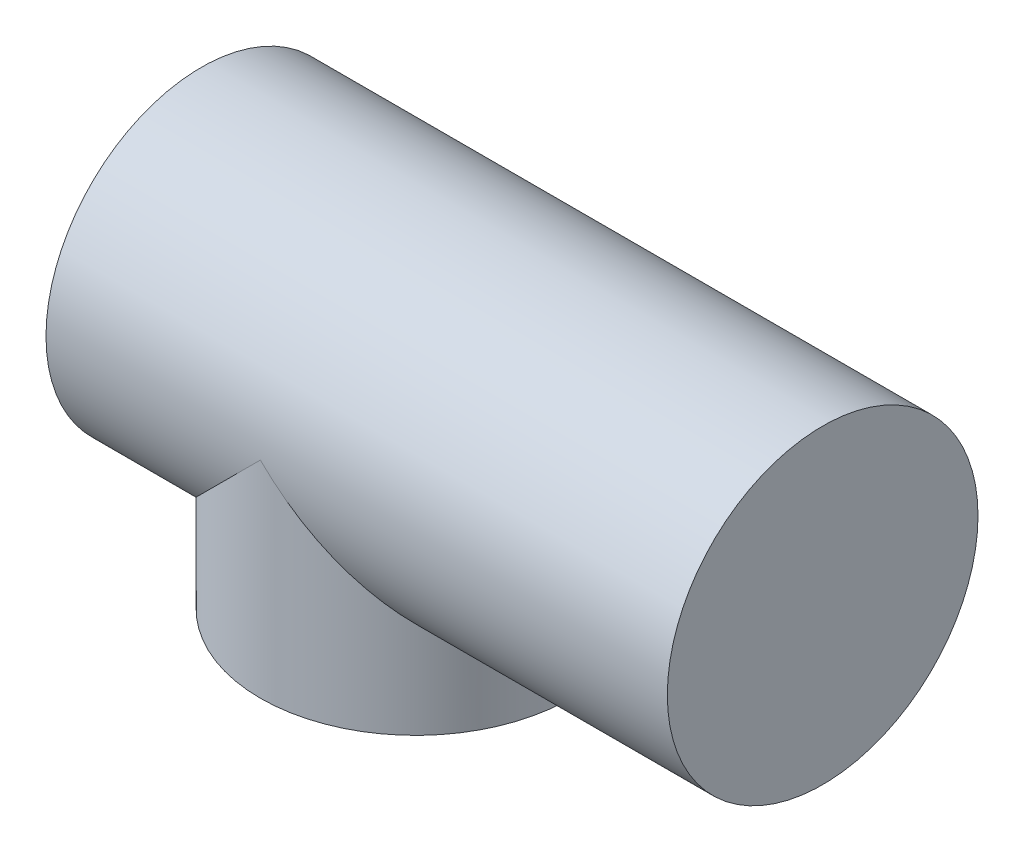
ISO-10303-21;
HEADER;
FILE_DESCRIPTION(('STEP AP214'),'2;1');
FILE_NAME('part.step','',(''),(''),'','','');
FILE_SCHEMA(('AUTOMOTIVE_DESIGN { 1 0 10303 214 1 1 1 1 }'));
ENDSEC;
DATA;
#1=APPLICATION_CONTEXT('core data for automotive mechanical design processes');
#2=APPLICATION_PROTOCOL_DEFINITION('international standard','automotive_design',2000,#1);
#3=PRODUCT_CONTEXT('',#1,'mechanical');
#4=PRODUCT('Part','Part','',(#3));
#5=PRODUCT_RELATED_PRODUCT_CATEGORY('part','',(#4));
#6=PRODUCT_DEFINITION_FORMATION('','',#4);
#7=PRODUCT_DEFINITION_CONTEXT('part definition',#1,'design');
#8=PRODUCT_DEFINITION('design','',#6,#7);
#9=PRODUCT_DEFINITION_SHAPE('','',#8);
#10=(LENGTH_UNIT() NAMED_UNIT(*) SI_UNIT(.MILLI.,.METRE.));
#11=(NAMED_UNIT(*) PLANE_ANGLE_UNIT() SI_UNIT($,.RADIAN.));
#12=(NAMED_UNIT(*) SI_UNIT($,.STERADIAN.) SOLID_ANGLE_UNIT());
#13=UNCERTAINTY_MEASURE_WITH_UNIT(LENGTH_MEASURE(1.E-05),#10,'distance_accuracy_value','');
#14=(GEOMETRIC_REPRESENTATION_CONTEXT(3) GLOBAL_UNCERTAINTY_ASSIGNED_CONTEXT((#13)) GLOBAL_UNIT_ASSIGNED_CONTEXT((#10,
#11,#12)) REPRESENTATION_CONTEXT('',''));
#15=CARTESIAN_POINT('',(0.,0.,0.));
#16=DIRECTION('',(0.,0.,1.));
#17=DIRECTION('',(1.,0.,0.));
#18=AXIS2_PLACEMENT_3D('',#15,#16,#17);
#19=CARTESIAN_POINT('',(0.,0.,0.));
#20=DIRECTION('',(1.,0.,0.));
#21=DIRECTION('',(0.,0.,-1.));
#22=AXIS2_PLACEMENT_3D('',#19,#20,#21);
#23=PLANE('',#22);
#24=CARTESIAN_POINT('',(0.,0.,0.));
#25=DIRECTION('',(1.,0.,0.));
#26=DIRECTION('',(0.,0.,-1.));
#27=AXIS2_PLACEMENT_3D('',#24,#25,#26);
#28=CIRCLE('',#27,25.);
#29=CARTESIAN_POINT('',(0.,0.,-25.));
#30=VERTEX_POINT('',#29);
#31=EDGE_CURVE('E64',#30,#30,#28,.T.);
#32=ORIENTED_EDGE('',*,*,#31,.F.);
#33=EDGE_LOOP('',(#32));
#34=FACE_BOUND('',#33,.T.);
#35=ADVANCED_FACE('F45',(#34),#23,.F.);
#36=CARTESIAN_POINT('',(100.,0.,0.));
#37=DIRECTION('',(1.,0.,0.));
#38=DIRECTION('',(0.,0.,-1.));
#39=AXIS2_PLACEMENT_3D('',#36,#37,#38);
#40=PLANE('',#39);
#41=CARTESIAN_POINT('',(100.,0.,0.));
#42=DIRECTION('',(1.,0.,0.));
#43=DIRECTION('',(0.,0.,-1.));
#44=AXIS2_PLACEMENT_3D('',#41,#42,#43);
#45=CIRCLE('',#44,25.);
#46=CARTESIAN_POINT('',(100.,0.,-25.));
#47=VERTEX_POINT('',#46);
#48=EDGE_CURVE('E62',#47,#47,#45,.T.);
#49=ORIENTED_EDGE('',*,*,#48,.T.);
#50=EDGE_LOOP('',(#49));
#51=FACE_BOUND('',#50,.T.);
#52=ADVANCED_FACE('F82',(#51),#40,.T.);
#53=CARTESIAN_POINT('',(0.,0.,0.));
#54=DIRECTION('',(1.,0.,0.));
#55=DIRECTION('',(0.,0.,-1.));
#56=AXIS2_PLACEMENT_3D('',#53,#54,#55);
#57=CYLINDRICAL_SURFACE('',#56,25.);
#58=CARTESIAN_POINT('',(34.5,0.,0.));
#59=DIRECTION('',(0.707106781186548,0.707106781186547,0.));
#60=DIRECTION('',(0.707106781186548,-0.707106781186547,0.));
#61=AXIS2_PLACEMENT_3D('',#58,#59,#60);
#62=ELLIPSE('',#61,35.3553390593274,25.);
#63=CARTESIAN_POINT('',(34.5,0.,-25.));
#64=VERTEX_POINT('',#63);
#65=CARTESIAN_POINT('',(34.5,0.,25.));
#66=VERTEX_POINT('',#65);
#67=EDGE_CURVE('E11',#64,#66,#62,.F.);
#68=ORIENTED_EDGE('',*,*,#67,.F.);
#69=CARTESIAN_POINT('',(34.5,0.,0.));
#70=DIRECTION('',(0.707106781186548,-0.707106781186547,0.));
#71=DIRECTION('',(0.707106781186548,0.707106781186547,0.));
#72=AXIS2_PLACEMENT_3D('',#69,#70,#71);
#73=ELLIPSE('',#72,35.3553390593274,25.);
#74=EDGE_CURVE('E52',#66,#64,#73,.T.);
#75=ORIENTED_EDGE('',*,*,#74,.F.);
#76=EDGE_LOOP('',(#68,#75));
#77=FACE_BOUND('',#76,.T.);
#78=ORIENTED_EDGE('',*,*,#48,.F.);
#79=EDGE_LOOP('',(#78));
#80=FACE_BOUND('',#79,.T.);
#81=ORIENTED_EDGE('',*,*,#31,.T.);
#82=EDGE_LOOP('',(#81));
#83=FACE_BOUND('',#82,.T.);
#84=ADVANCED_FACE('F58',(#77,#80,#83),#57,.T.);
#85=CARTESIAN_POINT('',(34.5,-33.2,0.));
#86=DIRECTION('',(0.,1.,0.));
#87=DIRECTION('',(0.,0.,1.));
#88=AXIS2_PLACEMENT_3D('',#85,#86,#87);
#89=CYLINDRICAL_SURFACE('',#88,25.);
#90=CARTESIAN_POINT('',(34.5,-33.2,0.));
#91=DIRECTION('',(0.,1.,0.));
#92=DIRECTION('',(0.,0.,1.));
#93=AXIS2_PLACEMENT_3D('',#90,#91,#92);
#94=CIRCLE('',#93,25.);
#95=CARTESIAN_POINT('',(34.5,-33.2,25.));
#96=VERTEX_POINT('',#95);
#97=EDGE_CURVE('E69',#96,#96,#94,.T.);
#98=ORIENTED_EDGE('',*,*,#97,.T.);
#99=EDGE_LOOP('',(#98));
#100=FACE_BOUND('',#99,.T.);
#101=ORIENTED_EDGE('',*,*,#74,.T.);
#102=ORIENTED_EDGE('',*,*,#67,.T.);
#103=EDGE_LOOP('',(#101,#102));
#104=FACE_BOUND('',#103,.T.);
#105=ADVANCED_FACE('F61',(#100,#104),#89,.T.);
#106=CARTESIAN_POINT('',(34.5,-33.2,0.));
#107=DIRECTION('',(0.,1.,0.));
#108=DIRECTION('',(0.,0.,1.));
#109=AXIS2_PLACEMENT_3D('',#106,#107,#108);
#110=PLANE('',#109);
#111=ORIENTED_EDGE('',*,*,#97,.F.);
#112=EDGE_LOOP('',(#111));
#113=FACE_BOUND('',#112,.T.);
#114=ADVANCED_FACE('F74',(#113),#110,.F.);
#115=CLOSED_SHELL('',(#35,#52,#84,#105,#114));
#116=MANIFOLD_SOLID_BREP('B2',#115);
#117=ADVANCED_BREP_SHAPE_REPRESENTATION('',(#18,#116),#14);
#118=SHAPE_DEFINITION_REPRESENTATION(#9,#117);
ENDSEC;
END-ISO-10303-21;
